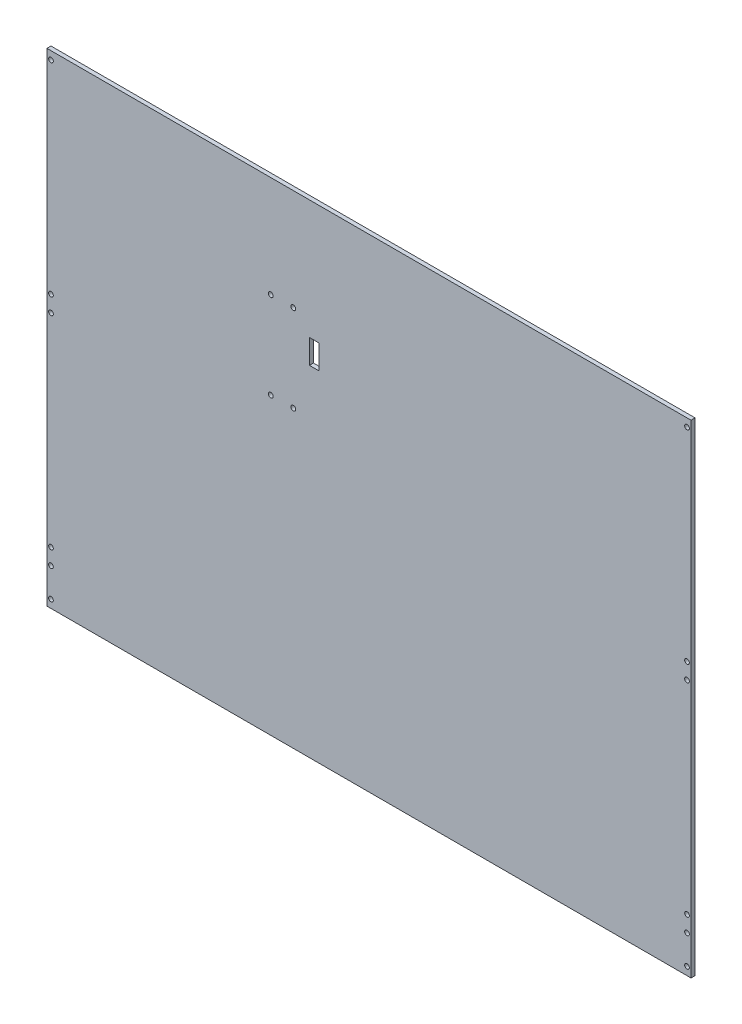
ISO-10303-21;
HEADER;
FILE_DESCRIPTION(('STEP AP214'),'2;1');
FILE_NAME('part.step','',(''),(''),'','','');
FILE_SCHEMA(('AUTOMOTIVE_DESIGN { 1 0 10303 214 1 1 1 1 }'));
ENDSEC;
DATA;
#1=APPLICATION_CONTEXT('core data for automotive mechanical design processes');
#2=APPLICATION_PROTOCOL_DEFINITION('international standard','automotive_design',2000,#1);
#3=PRODUCT_CONTEXT('',#1,'mechanical');
#4=PRODUCT('Part','Part','',(#3));
#5=PRODUCT_RELATED_PRODUCT_CATEGORY('part','',(#4));
#6=PRODUCT_DEFINITION_FORMATION('','',#4);
#7=PRODUCT_DEFINITION_CONTEXT('part definition',#1,'design');
#8=PRODUCT_DEFINITION('design','',#6,#7);
#9=PRODUCT_DEFINITION_SHAPE('','',#8);
#10=(LENGTH_UNIT() NAMED_UNIT(*) SI_UNIT(.MILLI.,.METRE.));
#11=(NAMED_UNIT(*) PLANE_ANGLE_UNIT() SI_UNIT($,.RADIAN.));
#12=(NAMED_UNIT(*) SI_UNIT($,.STERADIAN.) SOLID_ANGLE_UNIT());
#13=UNCERTAINTY_MEASURE_WITH_UNIT(LENGTH_MEASURE(1.E-05),#10,'distance_accuracy_value','');
#14=(GEOMETRIC_REPRESENTATION_CONTEXT(3) GLOBAL_UNCERTAINTY_ASSIGNED_CONTEXT((#13)) GLOBAL_UNIT_ASSIGNED_CONTEXT((#10,
#11,#12)) REPRESENTATION_CONTEXT('',''));
#15=CARTESIAN_POINT('',(0.,0.,0.));
#16=DIRECTION('',(0.,0.,1.));
#17=DIRECTION('',(1.,0.,0.));
#18=AXIS2_PLACEMENT_3D('',#15,#16,#17);
#19=CARTESIAN_POINT('',(254.,-190.5,3.175));
#20=DIRECTION('',(-1.,0.,0.));
#21=DIRECTION('',(0.,0.,1.));
#22=AXIS2_PLACEMENT_3D('',#19,#20,#21);
#23=PLANE('',#22);
#24=DIRECTION('',(0.,1.,0.));
#25=VECTOR('',#24,1.);
#26=CARTESIAN_POINT('',(254.,-190.5,0.));
#27=LINE('',#26,#25);
#28=CARTESIAN_POINT('',(254.,-190.5,0.));
#29=VERTEX_POINT('',#28);
#30=CARTESIAN_POINT('',(254.,190.5,0.));
#31=VERTEX_POINT('',#30);
#32=EDGE_CURVE('E153',#29,#31,#27,.T.);
#33=ORIENTED_EDGE('',*,*,#32,.T.);
#34=DIRECTION('',(0.,0.,-1.));
#35=VECTOR('',#34,1.);
#36=CARTESIAN_POINT('',(254.,190.5,3.175));
#37=LINE('',#36,#35);
#38=CARTESIAN_POINT('',(254.,190.5,3.175));
#39=VERTEX_POINT('',#38);
#40=EDGE_CURVE('E11',#39,#31,#37,.T.);
#41=ORIENTED_EDGE('',*,*,#40,.F.);
#42=DIRECTION('',(0.,1.,0.));
#43=VECTOR('',#42,1.);
#44=CARTESIAN_POINT('',(254.,-190.5,3.175));
#45=LINE('',#44,#43);
#46=CARTESIAN_POINT('',(254.,-190.5,3.175));
#47=VERTEX_POINT('',#46);
#48=EDGE_CURVE('E154',#47,#39,#45,.T.);
#49=ORIENTED_EDGE('',*,*,#48,.F.);
#50=DIRECTION('',(0.,0.,-1.));
#51=VECTOR('',#50,1.);
#52=CARTESIAN_POINT('',(254.,-190.5,3.175));
#53=LINE('',#52,#51);
#54=EDGE_CURVE('E168',#47,#29,#53,.T.);
#55=ORIENTED_EDGE('',*,*,#54,.T.);
#56=EDGE_LOOP('',(#33,#41,#49,#55));
#57=FACE_BOUND('',#56,.T.);
#58=ADVANCED_FACE('F42',(#57),#23,.F.);
#59=CARTESIAN_POINT('',(-254.,190.5,3.175));
#60=DIRECTION('',(0.,-1.,0.));
#61=DIRECTION('',(0.,0.,-1.));
#62=AXIS2_PLACEMENT_3D('',#59,#60,#61);
#63=PLANE('',#62);
#64=DIRECTION('',(-1.,0.,0.));
#65=VECTOR('',#64,1.);
#66=CARTESIAN_POINT('',(-254.,190.5,0.));
#67=LINE('',#66,#65);
#68=CARTESIAN_POINT('',(-254.,190.5,0.));
#69=VERTEX_POINT('',#68);
#70=EDGE_CURVE('E172',#31,#69,#67,.T.);
#71=ORIENTED_EDGE('',*,*,#70,.T.);
#72=DIRECTION('',(0.,0.,-1.));
#73=VECTOR('',#72,1.);
#74=CARTESIAN_POINT('',(-254.,190.5,3.175));
#75=LINE('',#74,#73);
#76=CARTESIAN_POINT('',(-254.,190.5,3.175));
#77=VERTEX_POINT('',#76);
#78=EDGE_CURVE('E50',#77,#69,#75,.T.);
#79=ORIENTED_EDGE('',*,*,#78,.F.);
#80=DIRECTION('',(-1.,0.,0.));
#81=VECTOR('',#80,1.);
#82=CARTESIAN_POINT('',(-254.,190.5,3.175));
#83=LINE('',#82,#81);
#84=EDGE_CURVE('E158',#39,#77,#83,.T.);
#85=ORIENTED_EDGE('',*,*,#84,.F.);
#86=ORIENTED_EDGE('',*,*,#40,.T.);
#87=EDGE_LOOP('',(#71,#79,#85,#86));
#88=FACE_BOUND('',#87,.T.);
#89=ADVANCED_FACE('F206',(#88),#63,.F.);
#90=CARTESIAN_POINT('',(-254.,-190.5,3.175));
#91=DIRECTION('',(1.,0.,0.));
#92=DIRECTION('',(0.,0.,-1.));
#93=AXIS2_PLACEMENT_3D('',#90,#91,#92);
#94=PLANE('',#93);
#95=DIRECTION('',(0.,-1.,0.));
#96=VECTOR('',#95,1.);
#97=CARTESIAN_POINT('',(-254.,-190.5,0.));
#98=LINE('',#97,#96);
#99=CARTESIAN_POINT('',(-254.,-190.5,0.));
#100=VERTEX_POINT('',#99);
#101=EDGE_CURVE('E175',#69,#100,#98,.T.);
#102=ORIENTED_EDGE('',*,*,#101,.T.);
#103=DIRECTION('',(0.,0.,-1.));
#104=VECTOR('',#103,1.);
#105=CARTESIAN_POINT('',(-254.,-190.5,3.175));
#106=LINE('',#105,#104);
#107=CARTESIAN_POINT('',(-254.,-190.5,3.175));
#108=VERTEX_POINT('',#107);
#109=EDGE_CURVE('E183',#108,#100,#106,.T.);
#110=ORIENTED_EDGE('',*,*,#109,.F.);
#111=DIRECTION('',(0.,-1.,0.));
#112=VECTOR('',#111,1.);
#113=CARTESIAN_POINT('',(-254.,-190.5,3.175));
#114=LINE('',#113,#112);
#115=EDGE_CURVE('E162',#77,#108,#114,.T.);
#116=ORIENTED_EDGE('',*,*,#115,.F.);
#117=ORIENTED_EDGE('',*,*,#78,.T.);
#118=EDGE_LOOP('',(#102,#110,#116,#117));
#119=FACE_BOUND('',#118,.T.);
#120=ADVANCED_FACE('F192',(#119),#94,.F.);
#121=CARTESIAN_POINT('',(-254.,-190.5,3.175));
#122=DIRECTION('',(0.,1.,0.));
#123=DIRECTION('',(0.,0.,1.));
#124=AXIS2_PLACEMENT_3D('',#121,#122,#123);
#125=PLANE('',#124);
#126=DIRECTION('',(1.,0.,0.));
#127=VECTOR('',#126,1.);
#128=CARTESIAN_POINT('',(-254.,-190.5,0.));
#129=LINE('',#128,#127);
#130=EDGE_CURVE('E159',#100,#29,#129,.T.);
#131=ORIENTED_EDGE('',*,*,#130,.T.);
#132=ORIENTED_EDGE('',*,*,#54,.F.);
#133=DIRECTION('',(1.,0.,0.));
#134=VECTOR('',#133,1.);
#135=CARTESIAN_POINT('',(-254.,-190.5,3.175));
#136=LINE('',#135,#134);
#137=EDGE_CURVE('E165',#108,#47,#136,.T.);
#138=ORIENTED_EDGE('',*,*,#137,.F.);
#139=ORIENTED_EDGE('',*,*,#109,.T.);
#140=EDGE_LOOP('',(#131,#132,#138,#139));
#141=FACE_BOUND('',#140,.T.);
#142=ADVANCED_FACE('F199',(#141),#125,.F.);
#143=CARTESIAN_POINT('',(0.,0.,3.175));
#144=DIRECTION('',(0.,0.,-1.));
#145=DIRECTION('',(-1.,0.,0.));
#146=AXIS2_PLACEMENT_3D('',#143,#144,#145);
#147=PLANE('',#146);
#148=CARTESIAN_POINT('',(250.825,24.13,3.175));
#149=DIRECTION('',(0.,0.,1.));
#150=DIRECTION('',(1.,0.,0.));
#151=AXIS2_PLACEMENT_3D('',#148,#149,#150);
#152=CIRCLE('',#151,1.85420000000004);
#153=CARTESIAN_POINT('',(252.6792,24.13,3.175));
#154=VERTEX_POINT('',#153);
#155=EDGE_CURVE('E375',#154,#154,#152,.T.);
#156=ORIENTED_EDGE('',*,*,#155,.F.);
#157=EDGE_LOOP('',(#156));
#158=FACE_BOUND('',#157,.T.);
#159=CARTESIAN_POINT('',(-250.825,-148.59,3.175));
#160=DIRECTION('',(0.,0.,1.));
#161=DIRECTION('',(1.,0.,0.));
#162=AXIS2_PLACEMENT_3D('',#159,#160,#161);
#163=CIRCLE('',#162,1.85419999999999);
#164=CARTESIAN_POINT('',(-248.9708,-148.59,3.175));
#165=VERTEX_POINT('',#164);
#166=EDGE_CURVE('E384',#165,#165,#163,.T.);
#167=ORIENTED_EDGE('',*,*,#166,.F.);
#168=EDGE_LOOP('',(#167));
#169=FACE_BOUND('',#168,.T.);
#170=CARTESIAN_POINT('',(-250.825,11.43,3.175));
#171=DIRECTION('',(0.,0.,1.));
#172=DIRECTION('',(1.,0.,0.));
#173=AXIS2_PLACEMENT_3D('',#170,#171,#172);
#174=CIRCLE('',#173,1.85419999999999);
#175=CARTESIAN_POINT('',(-248.9708,11.43,3.175));
#176=VERTEX_POINT('',#175);
#177=EDGE_CURVE('E359',#176,#176,#174,.T.);
#178=ORIENTED_EDGE('',*,*,#177,.F.);
#179=EDGE_LOOP('',(#178));
#180=FACE_BOUND('',#179,.T.);
#181=CARTESIAN_POINT('',(-250.825,-161.29,3.175));
#182=DIRECTION('',(0.,0.,1.));
#183=DIRECTION('',(1.,0.,0.));
#184=AXIS2_PLACEMENT_3D('',#181,#182,#183);
#185=CIRCLE('',#184,1.85419999999999);
#186=CARTESIAN_POINT('',(-248.9708,-161.29,3.175));
#187=VERTEX_POINT('',#186);
#188=EDGE_CURVE('E368',#187,#187,#185,.T.);
#189=ORIENTED_EDGE('',*,*,#188,.F.);
#190=EDGE_LOOP('',(#189));
#191=FACE_BOUND('',#190,.T.);
#192=CARTESIAN_POINT('',(-250.825,24.13,3.175));
#193=DIRECTION('',(0.,0.,1.));
#194=DIRECTION('',(1.,0.,0.));
#195=AXIS2_PLACEMENT_3D('',#192,#193,#194);
#196=CIRCLE('',#195,1.85419999999999);
#197=CARTESIAN_POINT('',(-248.9708,24.13,3.175));
#198=VERTEX_POINT('',#197);
#199=EDGE_CURVE('E416',#198,#198,#196,.T.);
#200=ORIENTED_EDGE('',*,*,#199,.F.);
#201=EDGE_LOOP('',(#200));
#202=FACE_BOUND('',#201,.T.);
#203=CARTESIAN_POINT('',(250.825,-184.15,3.175));
#204=DIRECTION('',(0.,0.,1.));
#205=DIRECTION('',(1.,0.,0.));
#206=AXIS2_PLACEMENT_3D('',#203,#204,#205);
#207=CIRCLE('',#206,1.85419999999999);
#208=CARTESIAN_POINT('',(252.6792,-184.15,3.175));
#209=VERTEX_POINT('',#208);
#210=EDGE_CURVE('E408',#209,#209,#207,.T.);
#211=ORIENTED_EDGE('',*,*,#210,.F.);
#212=EDGE_LOOP('',(#211));
#213=FACE_BOUND('',#212,.T.);
#214=CARTESIAN_POINT('',(250.825,184.15,3.175));
#215=DIRECTION('',(0.,0.,1.));
#216=DIRECTION('',(1.,0.,0.));
#217=AXIS2_PLACEMENT_3D('',#214,#215,#216);
#218=CIRCLE('',#217,1.85419999999999);
#219=CARTESIAN_POINT('',(252.6792,184.15,3.175));
#220=VERTEX_POINT('',#219);
#221=EDGE_CURVE('E400',#220,#220,#218,.T.);
#222=ORIENTED_EDGE('',*,*,#221,.F.);
#223=EDGE_LOOP('',(#222));
#224=FACE_BOUND('',#223,.T.);
#225=CARTESIAN_POINT('',(-250.825,184.15,3.175));
#226=DIRECTION('',(0.,0.,1.));
#227=DIRECTION('',(1.,0.,0.));
#228=AXIS2_PLACEMENT_3D('',#225,#226,#227);
#229=CIRCLE('',#228,1.85419999999999);
#230=CARTESIAN_POINT('',(-248.9708,184.15,3.175));
#231=VERTEX_POINT('',#230);
#232=EDGE_CURVE('E391',#231,#231,#229,.T.);
#233=ORIENTED_EDGE('',*,*,#232,.F.);
#234=EDGE_LOOP('',(#233));
#235=FACE_BOUND('',#234,.T.);
#236=CARTESIAN_POINT('',(-77.4886690000001,41.91,3.175));
#237=DIRECTION('',(0.,0.,1.));
#238=DIRECTION('',(1.,0.,0.));
#239=AXIS2_PLACEMENT_3D('',#236,#237,#238);
#240=CIRCLE('',#239,1.90499999999999);
#241=CARTESIAN_POINT('',(-75.5836690000001,41.91,3.175));
#242=VERTEX_POINT('',#241);
#243=EDGE_CURVE('E315',#242,#242,#240,.T.);
#244=ORIENTED_EDGE('',*,*,#243,.F.);
#245=EDGE_LOOP('',(#244));
#246=FACE_BOUND('',#245,.T.);
#247=CARTESIAN_POINT('',(-59.7086690000001,110.49,3.175));
#248=DIRECTION('',(0.,0.,1.));
#249=DIRECTION('',(1.,0.,0.));
#250=AXIS2_PLACEMENT_3D('',#247,#248,#249);
#251=CIRCLE('',#250,1.90499999999999);
#252=CARTESIAN_POINT('',(-57.8036690000001,110.49,3.175));
#253=VERTEX_POINT('',#252);
#254=EDGE_CURVE('E311',#253,#253,#251,.T.);
#255=ORIENTED_EDGE('',*,*,#254,.F.);
#256=EDGE_LOOP('',(#255));
#257=FACE_BOUND('',#256,.T.);
#258=CARTESIAN_POINT('',(-59.7086690000001,41.91,3.175));
#259=DIRECTION('',(0.,0.,1.));
#260=DIRECTION('',(1.,0.,0.));
#261=AXIS2_PLACEMENT_3D('',#258,#259,#260);
#262=CIRCLE('',#261,1.90499999999999);
#263=CARTESIAN_POINT('',(-57.8036690000001,41.91,3.175));
#264=VERTEX_POINT('',#263);
#265=EDGE_CURVE('E303',#264,#264,#262,.T.);
#266=ORIENTED_EDGE('',*,*,#265,.F.);
#267=EDGE_LOOP('',(#266));
#268=FACE_BOUND('',#267,.T.);
#269=CARTESIAN_POINT('',(-77.4886690000001,110.49,3.175));
#270=DIRECTION('',(0.,0.,1.));
#271=DIRECTION('',(1.,0.,0.));
#272=AXIS2_PLACEMENT_3D('',#269,#270,#271);
#273=CIRCLE('',#272,1.90499999999999);
#274=CARTESIAN_POINT('',(-75.5836690000001,110.49,3.175));
#275=VERTEX_POINT('',#274);
#276=EDGE_CURVE('E352',#275,#275,#273,.T.);
#277=ORIENTED_EDGE('',*,*,#276,.F.);
#278=EDGE_LOOP('',(#277));
#279=FACE_BOUND('',#278,.T.);
#280=CARTESIAN_POINT('',(250.825,11.4299999999998,3.175));
#281=DIRECTION('',(0.,0.,1.));
#282=DIRECTION('',(-1.,0.,0.));
#283=AXIS2_PLACEMENT_3D('',#280,#281,#282);
#284=CIRCLE('',#283,1.85419999999999);
#285=CARTESIAN_POINT('',(248.9708,11.4299999999998,3.175));
#286=VERTEX_POINT('',#285);
#287=EDGE_CURVE('E344',#286,#286,#284,.T.);
#288=ORIENTED_EDGE('',*,*,#287,.F.);
#289=EDGE_LOOP('',(#288));
#290=FACE_BOUND('',#289,.T.);
#291=CARTESIAN_POINT('',(250.825,-148.59,3.175));
#292=DIRECTION('',(0.,0.,1.));
#293=DIRECTION('',(-1.,0.,0.));
#294=AXIS2_PLACEMENT_3D('',#291,#292,#293);
#295=CIRCLE('',#294,1.85419999999999);
#296=CARTESIAN_POINT('',(248.9708,-148.59,3.175));
#297=VERTEX_POINT('',#296);
#298=EDGE_CURVE('E336',#297,#297,#295,.T.);
#299=ORIENTED_EDGE('',*,*,#298,.F.);
#300=EDGE_LOOP('',(#299));
#301=FACE_BOUND('',#300,.T.);
#302=CARTESIAN_POINT('',(250.825,-161.29,3.175));
#303=DIRECTION('',(0.,0.,1.));
#304=DIRECTION('',(-1.,0.,0.));
#305=AXIS2_PLACEMENT_3D('',#302,#303,#304);
#306=CIRCLE('',#305,1.85419999999999);
#307=CARTESIAN_POINT('',(248.9708,-161.29,3.175));
#308=VERTEX_POINT('',#307);
#309=EDGE_CURVE('E327',#308,#308,#306,.T.);
#310=ORIENTED_EDGE('',*,*,#309,.F.);
#311=EDGE_LOOP('',(#310));
#312=FACE_BOUND('',#311,.T.);
#313=CARTESIAN_POINT('',(-250.825,-184.15,3.175));
#314=DIRECTION('',(0.,0.,1.));
#315=DIRECTION('',(1.,0.,0.));
#316=AXIS2_PLACEMENT_3D('',#313,#314,#315);
#317=CIRCLE('',#316,1.85419999999999);
#318=CARTESIAN_POINT('',(-248.9708,-184.15,3.175));
#319=VERTEX_POINT('',#318);
#320=EDGE_CURVE('E395',#319,#319,#317,.T.);
#321=ORIENTED_EDGE('',*,*,#320,.F.);
#322=EDGE_LOOP('',(#321));
#323=FACE_BOUND('',#322,.T.);
#324=DIRECTION('',(0.,1.,0.));
#325=VECTOR('',#324,1.);
#326=CARTESIAN_POINT('',(-39.3700000000001,77.47,3.175));
#327=LINE('',#326,#325);
#328=CARTESIAN_POINT('',(-39.3700000000001,77.47,3.175));
#329=VERTEX_POINT('',#328);
#330=CARTESIAN_POINT('',(-39.3700000000001,96.52,3.175));
#331=VERTEX_POINT('',#330);
#332=EDGE_CURVE('E135',#329,#331,#327,.T.);
#333=ORIENTED_EDGE('',*,*,#332,.F.);
#334=DIRECTION('',(1.,0.,0.));
#335=VECTOR('',#334,1.);
#336=CARTESIAN_POINT('',(-46.9900000000001,77.47,3.175));
#337=LINE('',#336,#335);
#338=CARTESIAN_POINT('',(-46.9900000000001,77.47,3.175));
#339=VERTEX_POINT('',#338);
#340=EDGE_CURVE('E125',#339,#329,#337,.T.);
#341=ORIENTED_EDGE('',*,*,#340,.F.);
#342=DIRECTION('',(0.,-1.,0.));
#343=VECTOR('',#342,1.);
#344=CARTESIAN_POINT('',(-46.9900000000001,77.47,3.175));
#345=LINE('',#344,#343);
#346=CARTESIAN_POINT('',(-46.9900000000001,96.52,3.175));
#347=VERTEX_POINT('',#346);
#348=EDGE_CURVE('E139',#347,#339,#345,.T.);
#349=ORIENTED_EDGE('',*,*,#348,.F.);
#350=DIRECTION('',(-1.,0.,0.));
#351=VECTOR('',#350,1.);
#352=CARTESIAN_POINT('',(-46.9900000000001,96.52,3.175));
#353=LINE('',#352,#351);
#354=EDGE_CURVE('E57',#331,#347,#353,.T.);
#355=ORIENTED_EDGE('',*,*,#354,.F.);
#356=EDGE_LOOP('',(#333,#341,#349,#355));
#357=FACE_BOUND('',#356,.T.);
#358=ORIENTED_EDGE('',*,*,#48,.T.);
#359=ORIENTED_EDGE('',*,*,#84,.T.);
#360=ORIENTED_EDGE('',*,*,#115,.T.);
#361=ORIENTED_EDGE('',*,*,#137,.T.);
#362=EDGE_LOOP('',(#358,#359,#360,#361));
#363=FACE_BOUND('',#362,.T.);
#364=ADVANCED_FACE('F205',(#158,#169,#180,#191,#202,#213,#224,#235,#246,#257,#268,#279,#290,
#301,#312,#323,#357,#363),#147,.F.);
#365=CARTESIAN_POINT('',(0.,0.,0.));
#366=DIRECTION('',(0.,0.,-1.));
#367=DIRECTION('',(-1.,0.,0.));
#368=AXIS2_PLACEMENT_3D('',#365,#366,#367);
#369=PLANE('',#368);
#370=CARTESIAN_POINT('',(250.825,24.13,0.));
#371=DIRECTION('',(0.,0.,1.));
#372=DIRECTION('',(1.,0.,0.));
#373=AXIS2_PLACEMENT_3D('',#370,#371,#372);
#374=CIRCLE('',#373,1.85420000000004);
#375=CARTESIAN_POINT('',(252.6792,24.13,0.));
#376=VERTEX_POINT('',#375);
#377=EDGE_CURVE('E380',#376,#376,#374,.T.);
#378=ORIENTED_EDGE('',*,*,#377,.T.);
#379=EDGE_LOOP('',(#378));
#380=FACE_BOUND('',#379,.T.);
#381=CARTESIAN_POINT('',(-250.825,-148.59,0.));
#382=DIRECTION('',(0.,0.,1.));
#383=DIRECTION('',(1.,0.,0.));
#384=AXIS2_PLACEMENT_3D('',#381,#382,#383);
#385=CIRCLE('',#384,1.85419999999999);
#386=CARTESIAN_POINT('',(-248.9708,-148.59,0.));
#387=VERTEX_POINT('',#386);
#388=EDGE_CURVE('E363',#387,#387,#385,.T.);
#389=ORIENTED_EDGE('',*,*,#388,.T.);
#390=EDGE_LOOP('',(#389));
#391=FACE_BOUND('',#390,.T.);
#392=CARTESIAN_POINT('',(-250.825,11.43,0.));
#393=DIRECTION('',(0.,0.,1.));
#394=DIRECTION('',(1.,0.,0.));
#395=AXIS2_PLACEMENT_3D('',#392,#393,#394);
#396=CIRCLE('',#395,1.85419999999999);
#397=CARTESIAN_POINT('',(-248.9708,11.43,0.));
#398=VERTEX_POINT('',#397);
#399=EDGE_CURVE('E364',#398,#398,#396,.T.);
#400=ORIENTED_EDGE('',*,*,#399,.T.);
#401=EDGE_LOOP('',(#400));
#402=FACE_BOUND('',#401,.T.);
#403=CARTESIAN_POINT('',(-250.825,-161.29,0.));
#404=DIRECTION('',(0.,0.,1.));
#405=DIRECTION('',(1.,0.,0.));
#406=AXIS2_PLACEMENT_3D('',#403,#404,#405);
#407=CIRCLE('',#406,1.85419999999999);
#408=CARTESIAN_POINT('',(-248.9708,-161.29,0.));
#409=VERTEX_POINT('',#408);
#410=EDGE_CURVE('E331',#409,#409,#407,.T.);
#411=ORIENTED_EDGE('',*,*,#410,.T.);
#412=EDGE_LOOP('',(#411));
#413=FACE_BOUND('',#412,.T.);
#414=CARTESIAN_POINT('',(-250.825,24.13,0.));
#415=DIRECTION('',(0.,0.,1.));
#416=DIRECTION('',(1.,0.,0.));
#417=AXIS2_PLACEMENT_3D('',#414,#415,#416);
#418=CIRCLE('',#417,1.85419999999999);
#419=CARTESIAN_POINT('',(-248.9708,24.13,0.));
#420=VERTEX_POINT('',#419);
#421=EDGE_CURVE('E379',#420,#420,#418,.T.);
#422=ORIENTED_EDGE('',*,*,#421,.T.);
#423=EDGE_LOOP('',(#422));
#424=FACE_BOUND('',#423,.T.);
#425=CARTESIAN_POINT('',(250.825,-184.15,0.));
#426=DIRECTION('',(0.,0.,1.));
#427=DIRECTION('',(1.,0.,0.));
#428=AXIS2_PLACEMENT_3D('',#425,#426,#427);
#429=CIRCLE('',#428,1.85419999999999);
#430=CARTESIAN_POINT('',(252.6792,-184.15,0.));
#431=VERTEX_POINT('',#430);
#432=EDGE_CURVE('E412',#431,#431,#429,.T.);
#433=ORIENTED_EDGE('',*,*,#432,.T.);
#434=EDGE_LOOP('',(#433));
#435=FACE_BOUND('',#434,.T.);
#436=CARTESIAN_POINT('',(250.825,184.15,0.));
#437=DIRECTION('',(0.,0.,1.));
#438=DIRECTION('',(1.,0.,0.));
#439=AXIS2_PLACEMENT_3D('',#436,#437,#438);
#440=CIRCLE('',#439,1.85419999999999);
#441=CARTESIAN_POINT('',(252.6792,184.15,0.));
#442=VERTEX_POINT('',#441);
#443=EDGE_CURVE('E404',#442,#442,#440,.T.);
#444=ORIENTED_EDGE('',*,*,#443,.T.);
#445=EDGE_LOOP('',(#444));
#446=FACE_BOUND('',#445,.T.);
#447=CARTESIAN_POINT('',(-250.825,184.15,0.));
#448=DIRECTION('',(0.,0.,1.));
#449=DIRECTION('',(1.,0.,0.));
#450=AXIS2_PLACEMENT_3D('',#447,#448,#449);
#451=CIRCLE('',#450,1.85419999999999);
#452=CARTESIAN_POINT('',(-248.9708,184.15,0.));
#453=VERTEX_POINT('',#452);
#454=EDGE_CURVE('E396',#453,#453,#451,.T.);
#455=ORIENTED_EDGE('',*,*,#454,.T.);
#456=EDGE_LOOP('',(#455));
#457=FACE_BOUND('',#456,.T.);
#458=CARTESIAN_POINT('',(-77.4886690000001,41.91,0.));
#459=DIRECTION('',(0.,0.,1.));
#460=DIRECTION('',(1.,0.,0.));
#461=AXIS2_PLACEMENT_3D('',#458,#459,#460);
#462=CIRCLE('',#461,1.90499999999999);
#463=CARTESIAN_POINT('',(-75.5836690000001,41.91,0.));
#464=VERTEX_POINT('',#463);
#465=EDGE_CURVE('E320',#464,#464,#462,.T.);
#466=ORIENTED_EDGE('',*,*,#465,.T.);
#467=EDGE_LOOP('',(#466));
#468=FACE_BOUND('',#467,.T.);
#469=CARTESIAN_POINT('',(-59.7086690000001,110.49,0.));
#470=DIRECTION('',(0.,0.,1.));
#471=DIRECTION('',(1.,0.,0.));
#472=AXIS2_PLACEMENT_3D('',#469,#470,#471);
#473=CIRCLE('',#472,1.90499999999999);
#474=CARTESIAN_POINT('',(-57.8036690000001,110.49,0.));
#475=VERTEX_POINT('',#474);
#476=EDGE_CURVE('E306',#475,#475,#473,.T.);
#477=ORIENTED_EDGE('',*,*,#476,.T.);
#478=EDGE_LOOP('',(#477));
#479=FACE_BOUND('',#478,.T.);
#480=CARTESIAN_POINT('',(-59.7086690000001,41.91,0.));
#481=DIRECTION('',(0.,0.,1.));
#482=DIRECTION('',(1.,0.,0.));
#483=AXIS2_PLACEMENT_3D('',#480,#481,#482);
#484=CIRCLE('',#483,1.90499999999999);
#485=CARTESIAN_POINT('',(-57.8036690000001,41.91,0.));
#486=VERTEX_POINT('',#485);
#487=EDGE_CURVE('E300',#486,#486,#484,.T.);
#488=ORIENTED_EDGE('',*,*,#487,.T.);
#489=EDGE_LOOP('',(#488));
#490=FACE_BOUND('',#489,.T.);
#491=CARTESIAN_POINT('',(-77.4886690000001,110.49,0.));
#492=DIRECTION('',(0.,0.,1.));
#493=DIRECTION('',(1.,0.,0.));
#494=AXIS2_PLACEMENT_3D('',#491,#492,#493);
#495=CIRCLE('',#494,1.90499999999999);
#496=CARTESIAN_POINT('',(-75.5836690000001,110.49,0.));
#497=VERTEX_POINT('',#496);
#498=EDGE_CURVE('E319',#497,#497,#495,.T.);
#499=ORIENTED_EDGE('',*,*,#498,.T.);
#500=EDGE_LOOP('',(#499));
#501=FACE_BOUND('',#500,.T.);
#502=CARTESIAN_POINT('',(250.825,11.4299999999998,0.));
#503=DIRECTION('',(0.,0.,1.));
#504=DIRECTION('',(-1.,0.,0.));
#505=AXIS2_PLACEMENT_3D('',#502,#503,#504);
#506=CIRCLE('',#505,1.85419999999999);
#507=CARTESIAN_POINT('',(248.9708,11.4299999999998,0.));
#508=VERTEX_POINT('',#507);
#509=EDGE_CURVE('E348',#508,#508,#506,.T.);
#510=ORIENTED_EDGE('',*,*,#509,.T.);
#511=EDGE_LOOP('',(#510));
#512=FACE_BOUND('',#511,.T.);
#513=CARTESIAN_POINT('',(250.825,-148.59,0.));
#514=DIRECTION('',(0.,0.,1.));
#515=DIRECTION('',(-1.,0.,0.));
#516=AXIS2_PLACEMENT_3D('',#513,#514,#515);
#517=CIRCLE('',#516,1.85419999999999);
#518=CARTESIAN_POINT('',(248.9708,-148.59,0.));
#519=VERTEX_POINT('',#518);
#520=EDGE_CURVE('E340',#519,#519,#517,.T.);
#521=ORIENTED_EDGE('',*,*,#520,.T.);
#522=EDGE_LOOP('',(#521));
#523=FACE_BOUND('',#522,.T.);
#524=CARTESIAN_POINT('',(250.825,-161.29,0.));
#525=DIRECTION('',(0.,0.,1.));
#526=DIRECTION('',(-1.,0.,0.));
#527=AXIS2_PLACEMENT_3D('',#524,#525,#526);
#528=CIRCLE('',#527,1.85419999999999);
#529=CARTESIAN_POINT('',(248.9708,-161.29,0.));
#530=VERTEX_POINT('',#529);
#531=EDGE_CURVE('E332',#530,#530,#528,.T.);
#532=ORIENTED_EDGE('',*,*,#531,.T.);
#533=EDGE_LOOP('',(#532));
#534=FACE_BOUND('',#533,.T.);
#535=CARTESIAN_POINT('',(-250.825,-184.15,0.));
#536=DIRECTION('',(0.,0.,1.));
#537=DIRECTION('',(1.,0.,0.));
#538=AXIS2_PLACEMENT_3D('',#535,#536,#537);
#539=CIRCLE('',#538,1.85419999999999);
#540=CARTESIAN_POINT('',(-248.9708,-184.15,0.));
#541=VERTEX_POINT('',#540);
#542=EDGE_CURVE('E423',#541,#541,#539,.T.);
#543=ORIENTED_EDGE('',*,*,#542,.T.);
#544=EDGE_LOOP('',(#543));
#545=FACE_BOUND('',#544,.T.);
#546=DIRECTION('',(1.,0.,0.));
#547=VECTOR('',#546,1.);
#548=CARTESIAN_POINT('',(-46.9900000000001,77.47,0.));
#549=LINE('',#548,#547);
#550=CARTESIAN_POINT('',(-46.9900000000001,77.47,0.));
#551=VERTEX_POINT('',#550);
#552=CARTESIAN_POINT('',(-39.3700000000001,77.47,0.));
#553=VERTEX_POINT('',#552);
#554=EDGE_CURVE('E122',#551,#553,#549,.T.);
#555=ORIENTED_EDGE('',*,*,#554,.T.);
#556=DIRECTION('',(0.,1.,0.));
#557=VECTOR('',#556,1.);
#558=CARTESIAN_POINT('',(-39.3700000000001,77.47,0.));
#559=LINE('',#558,#557);
#560=CARTESIAN_POINT('',(-39.3700000000001,96.52,0.));
#561=VERTEX_POINT('',#560);
#562=EDGE_CURVE('E108',#553,#561,#559,.T.);
#563=ORIENTED_EDGE('',*,*,#562,.T.);
#564=DIRECTION('',(-1.,0.,0.));
#565=VECTOR('',#564,1.);
#566=CARTESIAN_POINT('',(-46.9900000000001,96.52,0.));
#567=LINE('',#566,#565);
#568=CARTESIAN_POINT('',(-46.9900000000001,96.52,0.));
#569=VERTEX_POINT('',#568);
#570=EDGE_CURVE('E144',#561,#569,#567,.T.);
#571=ORIENTED_EDGE('',*,*,#570,.T.);
#572=DIRECTION('',(0.,-1.,0.));
#573=VECTOR('',#572,1.);
#574=CARTESIAN_POINT('',(-46.9900000000001,77.47,0.));
#575=LINE('',#574,#573);
#576=EDGE_CURVE('E131',#569,#551,#575,.T.);
#577=ORIENTED_EDGE('',*,*,#576,.T.);
#578=EDGE_LOOP('',(#555,#563,#571,#577));
#579=FACE_BOUND('',#578,.T.);
#580=ORIENTED_EDGE('',*,*,#32,.F.);
#581=ORIENTED_EDGE('',*,*,#130,.F.);
#582=ORIENTED_EDGE('',*,*,#101,.F.);
#583=ORIENTED_EDGE('',*,*,#70,.F.);
#584=EDGE_LOOP('',(#580,#581,#582,#583));
#585=FACE_BOUND('',#584,.T.);
#586=ADVANCED_FACE('F129',(#380,#391,#402,#413,#424,#435,#446,#457,#468,#479,#490,#501,#512,
#523,#534,#545,#579,#585),#369,.T.);
#587=CARTESIAN_POINT('',(-46.9900000000001,77.47,-20.5174779151825));
#588=DIRECTION('',(0.,-1.,0.));
#589=DIRECTION('',(0.,0.,-1.));
#590=AXIS2_PLACEMENT_3D('',#587,#588,#589);
#591=PLANE('',#590);
#592=DIRECTION('',(0.,0.,1.));
#593=VECTOR('',#592,1.);
#594=CARTESIAN_POINT('',(-46.9900000000001,77.47,-20.5174779151825));
#595=LINE('',#594,#593);
#596=EDGE_CURVE('E65',#551,#339,#595,.T.);
#597=ORIENTED_EDGE('',*,*,#596,.T.);
#598=ORIENTED_EDGE('',*,*,#340,.T.);
#599=DIRECTION('',(0.,0.,1.));
#600=VECTOR('',#599,1.);
#601=CARTESIAN_POINT('',(-39.3700000000001,77.47,-20.5174779151825));
#602=LINE('',#601,#600);
#603=EDGE_CURVE('E112',#553,#329,#602,.T.);
#604=ORIENTED_EDGE('',*,*,#603,.F.);
#605=ORIENTED_EDGE('',*,*,#554,.F.);
#606=EDGE_LOOP('',(#597,#598,#604,#605));
#607=FACE_BOUND('',#606,.T.);
#608=ADVANCED_FACE('F121',(#607),#591,.F.);
#609=CARTESIAN_POINT('',(-39.3700000000001,77.47,-20.5174779151825));
#610=DIRECTION('',(1.,0.,0.));
#611=DIRECTION('',(0.,0.,-1.));
#612=AXIS2_PLACEMENT_3D('',#609,#610,#611);
#613=PLANE('',#612);
#614=ORIENTED_EDGE('',*,*,#603,.T.);
#615=ORIENTED_EDGE('',*,*,#332,.T.);
#616=DIRECTION('',(0.,0.,1.));
#617=VECTOR('',#616,1.);
#618=CARTESIAN_POINT('',(-39.3700000000001,96.52,-20.5174779151825));
#619=LINE('',#618,#617);
#620=EDGE_CURVE('E114',#561,#331,#619,.T.);
#621=ORIENTED_EDGE('',*,*,#620,.F.);
#622=ORIENTED_EDGE('',*,*,#562,.F.);
#623=EDGE_LOOP('',(#614,#615,#621,#622));
#624=FACE_BOUND('',#623,.T.);
#625=ADVANCED_FACE('F110',(#624),#613,.F.);
#626=CARTESIAN_POINT('',(-46.9900000000001,96.52,-20.5174779151825));
#627=DIRECTION('',(0.,1.,0.));
#628=DIRECTION('',(0.,0.,1.));
#629=AXIS2_PLACEMENT_3D('',#626,#627,#628);
#630=PLANE('',#629);
#631=ORIENTED_EDGE('',*,*,#620,.T.);
#632=ORIENTED_EDGE('',*,*,#354,.T.);
#633=DIRECTION('',(0.,0.,1.));
#634=VECTOR('',#633,1.);
#635=CARTESIAN_POINT('',(-46.9900000000001,96.52,-20.5174779151825));
#636=LINE('',#635,#634);
#637=EDGE_CURVE('E143',#569,#347,#636,.T.);
#638=ORIENTED_EDGE('',*,*,#637,.F.);
#639=ORIENTED_EDGE('',*,*,#570,.F.);
#640=EDGE_LOOP('',(#631,#632,#638,#639));
#641=FACE_BOUND('',#640,.T.);
#642=ADVANCED_FACE('F226',(#641),#630,.F.);
#643=CARTESIAN_POINT('',(-46.9900000000001,77.47,-20.5174779151825));
#644=DIRECTION('',(-1.,0.,0.));
#645=DIRECTION('',(0.,0.,1.));
#646=AXIS2_PLACEMENT_3D('',#643,#644,#645);
#647=PLANE('',#646);
#648=ORIENTED_EDGE('',*,*,#637,.T.);
#649=ORIENTED_EDGE('',*,*,#348,.T.);
#650=ORIENTED_EDGE('',*,*,#596,.F.);
#651=ORIENTED_EDGE('',*,*,#576,.F.);
#652=EDGE_LOOP('',(#648,#649,#650,#651));
#653=FACE_BOUND('',#652,.T.);
#654=ADVANCED_FACE('F229',(#653),#647,.F.);
#655=CARTESIAN_POINT('',(-250.825,-184.15,0.));
#656=DIRECTION('',(0.,0.,1.));
#657=DIRECTION('',(1.,0.,0.));
#658=AXIS2_PLACEMENT_3D('',#655,#656,#657);
#659=CYLINDRICAL_SURFACE('',#658,1.85419999999999);
#660=ORIENTED_EDGE('',*,*,#542,.F.);
#661=EDGE_LOOP('',(#660));
#662=FACE_BOUND('',#661,.T.);
#663=ORIENTED_EDGE('',*,*,#320,.T.);
#664=EDGE_LOOP('',(#663));
#665=FACE_BOUND('',#664,.T.);
#666=ADVANCED_FACE('F232',(#662,#665),#659,.F.);
#667=CARTESIAN_POINT('',(250.825,-161.29,0.));
#668=DIRECTION('',(0.,0.,1.));
#669=DIRECTION('',(1.,0.,0.));
#670=AXIS2_PLACEMENT_3D('',#667,#668,#669);
#671=CYLINDRICAL_SURFACE('',#670,1.85419999999999);
#672=ORIENTED_EDGE('',*,*,#531,.F.);
#673=EDGE_LOOP('',(#672));
#674=FACE_BOUND('',#673,.T.);
#675=ORIENTED_EDGE('',*,*,#309,.T.);
#676=EDGE_LOOP('',(#675));
#677=FACE_BOUND('',#676,.T.);
#678=ADVANCED_FACE('F235',(#674,#677),#671,.F.);
#679=CARTESIAN_POINT('',(250.825,-148.59,0.));
#680=DIRECTION('',(0.,0.,1.));
#681=DIRECTION('',(1.,0.,0.));
#682=AXIS2_PLACEMENT_3D('',#679,#680,#681);
#683=CYLINDRICAL_SURFACE('',#682,1.85419999999999);
#684=ORIENTED_EDGE('',*,*,#520,.F.);
#685=EDGE_LOOP('',(#684));
#686=FACE_BOUND('',#685,.T.);
#687=ORIENTED_EDGE('',*,*,#298,.T.);
#688=EDGE_LOOP('',(#687));
#689=FACE_BOUND('',#688,.T.);
#690=ADVANCED_FACE('F278',(#686,#689),#683,.F.);
#691=CARTESIAN_POINT('',(250.825,11.4299999999998,0.));
#692=DIRECTION('',(0.,0.,1.));
#693=DIRECTION('',(1.,0.,0.));
#694=AXIS2_PLACEMENT_3D('',#691,#692,#693);
#695=CYLINDRICAL_SURFACE('',#694,1.85419999999999);
#696=ORIENTED_EDGE('',*,*,#509,.F.);
#697=EDGE_LOOP('',(#696));
#698=FACE_BOUND('',#697,.T.);
#699=ORIENTED_EDGE('',*,*,#287,.T.);
#700=EDGE_LOOP('',(#699));
#701=FACE_BOUND('',#700,.T.);
#702=ADVANCED_FACE('F274',(#698,#701),#695,.F.);
#703=CARTESIAN_POINT('',(-77.4886690000001,110.49,0.));
#704=DIRECTION('',(0.,0.,1.));
#705=DIRECTION('',(1.,0.,0.));
#706=AXIS2_PLACEMENT_3D('',#703,#704,#705);
#707=CYLINDRICAL_SURFACE('',#706,1.90499999999999);
#708=ORIENTED_EDGE('',*,*,#498,.F.);
#709=EDGE_LOOP('',(#708));
#710=FACE_BOUND('',#709,.T.);
#711=ORIENTED_EDGE('',*,*,#276,.T.);
#712=EDGE_LOOP('',(#711));
#713=FACE_BOUND('',#712,.T.);
#714=ADVANCED_FACE('F270',(#710,#713),#707,.F.);
#715=CARTESIAN_POINT('',(-59.7086690000001,41.91,0.));
#716=DIRECTION('',(0.,0.,1.));
#717=DIRECTION('',(1.,0.,0.));
#718=AXIS2_PLACEMENT_3D('',#715,#716,#717);
#719=CYLINDRICAL_SURFACE('',#718,1.90499999999999);
#720=ORIENTED_EDGE('',*,*,#487,.F.);
#721=EDGE_LOOP('',(#720));
#722=FACE_BOUND('',#721,.T.);
#723=ORIENTED_EDGE('',*,*,#265,.T.);
#724=EDGE_LOOP('',(#723));
#725=FACE_BOUND('',#724,.T.);
#726=ADVANCED_FACE('F273',(#722,#725),#719,.F.);
#727=CARTESIAN_POINT('',(-59.7086690000001,110.49,0.));
#728=DIRECTION('',(0.,0.,1.));
#729=DIRECTION('',(1.,0.,0.));
#730=AXIS2_PLACEMENT_3D('',#727,#728,#729);
#731=CYLINDRICAL_SURFACE('',#730,1.90499999999999);
#732=ORIENTED_EDGE('',*,*,#476,.F.);
#733=EDGE_LOOP('',(#732));
#734=FACE_BOUND('',#733,.T.);
#735=ORIENTED_EDGE('',*,*,#254,.T.);
#736=EDGE_LOOP('',(#735));
#737=FACE_BOUND('',#736,.T.);
#738=ADVANCED_FACE('F286',(#734,#737),#731,.F.);
#739=CARTESIAN_POINT('',(-77.4886690000001,41.91,0.));
#740=DIRECTION('',(0.,0.,1.));
#741=DIRECTION('',(1.,0.,0.));
#742=AXIS2_PLACEMENT_3D('',#739,#740,#741);
#743=CYLINDRICAL_SURFACE('',#742,1.90499999999999);
#744=ORIENTED_EDGE('',*,*,#465,.F.);
#745=EDGE_LOOP('',(#744));
#746=FACE_BOUND('',#745,.T.);
#747=ORIENTED_EDGE('',*,*,#243,.T.);
#748=EDGE_LOOP('',(#747));
#749=FACE_BOUND('',#748,.T.);
#750=ADVANCED_FACE('F253',(#746,#749),#743,.F.);
#751=CARTESIAN_POINT('',(-250.825,184.15,0.));
#752=DIRECTION('',(0.,0.,1.));
#753=DIRECTION('',(1.,0.,0.));
#754=AXIS2_PLACEMENT_3D('',#751,#752,#753);
#755=CYLINDRICAL_SURFACE('',#754,1.85419999999999);
#756=ORIENTED_EDGE('',*,*,#454,.F.);
#757=EDGE_LOOP('',(#756));
#758=FACE_BOUND('',#757,.T.);
#759=ORIENTED_EDGE('',*,*,#232,.T.);
#760=EDGE_LOOP('',(#759));
#761=FACE_BOUND('',#760,.T.);
#762=ADVANCED_FACE('F249',(#758,#761),#755,.F.);
#763=CARTESIAN_POINT('',(250.825,184.15,0.));
#764=DIRECTION('',(0.,0.,1.));
#765=DIRECTION('',(1.,0.,0.));
#766=AXIS2_PLACEMENT_3D('',#763,#764,#765);
#767=CYLINDRICAL_SURFACE('',#766,1.85419999999999);
#768=ORIENTED_EDGE('',*,*,#443,.F.);
#769=EDGE_LOOP('',(#768));
#770=FACE_BOUND('',#769,.T.);
#771=ORIENTED_EDGE('',*,*,#221,.T.);
#772=EDGE_LOOP('',(#771));
#773=FACE_BOUND('',#772,.T.);
#774=ADVANCED_FACE('F245',(#770,#773),#767,.F.);
#775=CARTESIAN_POINT('',(250.825,-184.15,0.));
#776=DIRECTION('',(0.,0.,1.));
#777=DIRECTION('',(1.,0.,0.));
#778=AXIS2_PLACEMENT_3D('',#775,#776,#777);
#779=CYLINDRICAL_SURFACE('',#778,1.85419999999999);
#780=ORIENTED_EDGE('',*,*,#432,.F.);
#781=EDGE_LOOP('',(#780));
#782=FACE_BOUND('',#781,.T.);
#783=ORIENTED_EDGE('',*,*,#210,.T.);
#784=EDGE_LOOP('',(#783));
#785=FACE_BOUND('',#784,.T.);
#786=ADVANCED_FACE('F241',(#782,#785),#779,.F.);
#787=CARTESIAN_POINT('',(-250.825,24.13,0.));
#788=DIRECTION('',(0.,0.,1.));
#789=DIRECTION('',(1.,0.,0.));
#790=AXIS2_PLACEMENT_3D('',#787,#788,#789);
#791=CYLINDRICAL_SURFACE('',#790,1.85419999999999);
#792=ORIENTED_EDGE('',*,*,#421,.F.);
#793=EDGE_LOOP('',(#792));
#794=FACE_BOUND('',#793,.T.);
#795=ORIENTED_EDGE('',*,*,#199,.T.);
#796=EDGE_LOOP('',(#795));
#797=FACE_BOUND('',#796,.T.);
#798=ADVANCED_FACE('F237',(#794,#797),#791,.F.);
#799=CARTESIAN_POINT('',(-250.825,-161.29,0.));
#800=DIRECTION('',(0.,0.,1.));
#801=DIRECTION('',(1.,0.,0.));
#802=AXIS2_PLACEMENT_3D('',#799,#800,#801);
#803=CYLINDRICAL_SURFACE('',#802,1.85419999999999);
#804=ORIENTED_EDGE('',*,*,#410,.F.);
#805=EDGE_LOOP('',(#804));
#806=FACE_BOUND('',#805,.T.);
#807=ORIENTED_EDGE('',*,*,#188,.T.);
#808=EDGE_LOOP('',(#807));
#809=FACE_BOUND('',#808,.T.);
#810=ADVANCED_FACE('F240',(#806,#809),#803,.F.);
#811=CARTESIAN_POINT('',(-250.825,11.43,0.));
#812=DIRECTION('',(0.,0.,1.));
#813=DIRECTION('',(1.,0.,0.));
#814=AXIS2_PLACEMENT_3D('',#811,#812,#813);
#815=CYLINDRICAL_SURFACE('',#814,1.85419999999999);
#816=ORIENTED_EDGE('',*,*,#399,.F.);
#817=EDGE_LOOP('',(#816));
#818=FACE_BOUND('',#817,.T.);
#819=ORIENTED_EDGE('',*,*,#177,.T.);
#820=EDGE_LOOP('',(#819));
#821=FACE_BOUND('',#820,.T.);
#822=ADVANCED_FACE('F259',(#818,#821),#815,.F.);
#823=CARTESIAN_POINT('',(-250.825,-148.59,0.));
#824=DIRECTION('',(0.,0.,1.));
#825=DIRECTION('',(1.,0.,0.));
#826=AXIS2_PLACEMENT_3D('',#823,#824,#825);
#827=CYLINDRICAL_SURFACE('',#826,1.85419999999999);
#828=ORIENTED_EDGE('',*,*,#388,.F.);
#829=EDGE_LOOP('',(#828));
#830=FACE_BOUND('',#829,.T.);
#831=ORIENTED_EDGE('',*,*,#166,.T.);
#832=EDGE_LOOP('',(#831));
#833=FACE_BOUND('',#832,.T.);
#834=ADVANCED_FACE('F255',(#830,#833),#827,.F.);
#835=CARTESIAN_POINT('',(250.825,24.13,0.));
#836=DIRECTION('',(0.,0.,1.));
#837=DIRECTION('',(1.,0.,0.));
#838=AXIS2_PLACEMENT_3D('',#835,#836,#837);
#839=CYLINDRICAL_SURFACE('',#838,1.85420000000004);
#840=ORIENTED_EDGE('',*,*,#377,.F.);
#841=EDGE_LOOP('',(#840));
#842=FACE_BOUND('',#841,.T.);
#843=ORIENTED_EDGE('',*,*,#155,.T.);
#844=EDGE_LOOP('',(#843));
#845=FACE_BOUND('',#844,.T.);
#846=ADVANCED_FACE('F258',(#842,#845),#839,.F.);
#847=CLOSED_SHELL('',(#58,#89,#120,#142,#364,#586,#608,#625,#642,#654,#666,#678,#690,#702,#714,
#726,#738,#750,#762,#774,#786,#798,#810,#822,#834,#846));
#848=MANIFOLD_SOLID_BREP('B2',#847);
#849=ADVANCED_BREP_SHAPE_REPRESENTATION('',(#18,#848),#14);
#850=SHAPE_DEFINITION_REPRESENTATION(#9,#849);
ENDSEC;
END-ISO-10303-21;
